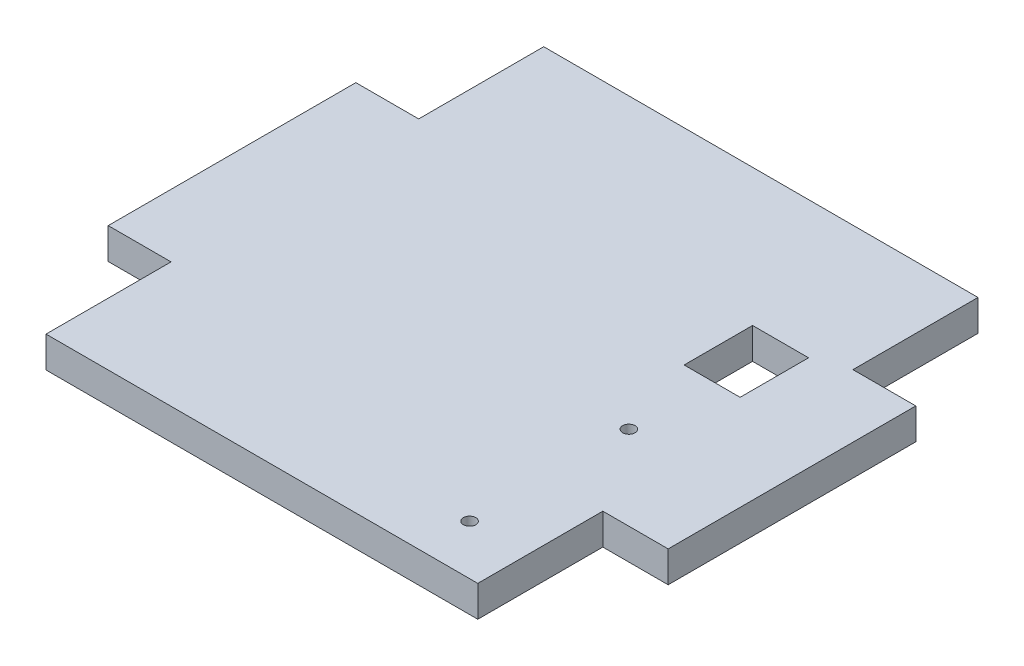
ISO-10303-21;
HEADER;
FILE_DESCRIPTION(('STEP AP214'),'2;1');
FILE_NAME('part.step','',(''),(''),'','','');
FILE_SCHEMA(('AUTOMOTIVE_DESIGN { 1 0 10303 214 1 1 1 1 }'));
ENDSEC;
DATA;
#1=APPLICATION_CONTEXT('core data for automotive mechanical design processes');
#2=APPLICATION_PROTOCOL_DEFINITION('international standard','automotive_design',2000,#1);
#3=PRODUCT_CONTEXT('',#1,'mechanical');
#4=PRODUCT('Part','Part','',(#3));
#5=PRODUCT_RELATED_PRODUCT_CATEGORY('part','',(#4));
#6=PRODUCT_DEFINITION_FORMATION('','',#4);
#7=PRODUCT_DEFINITION_CONTEXT('part definition',#1,'design');
#8=PRODUCT_DEFINITION('design','',#6,#7);
#9=PRODUCT_DEFINITION_SHAPE('','',#8);
#10=(LENGTH_UNIT() NAMED_UNIT(*) SI_UNIT(.MILLI.,.METRE.));
#11=(NAMED_UNIT(*) PLANE_ANGLE_UNIT() SI_UNIT($,.RADIAN.));
#12=(NAMED_UNIT(*) SI_UNIT($,.STERADIAN.) SOLID_ANGLE_UNIT());
#13=UNCERTAINTY_MEASURE_WITH_UNIT(LENGTH_MEASURE(1.E-05),#10,'distance_accuracy_value','');
#14=(GEOMETRIC_REPRESENTATION_CONTEXT(3) GLOBAL_UNCERTAINTY_ASSIGNED_CONTEXT((#13)) GLOBAL_UNIT_ASSIGNED_CONTEXT((#10,
#11,#12)) REPRESENTATION_CONTEXT('',''));
#15=CARTESIAN_POINT('',(0.,0.,0.));
#16=DIRECTION('',(0.,0.,1.));
#17=DIRECTION('',(1.,0.,0.));
#18=AXIS2_PLACEMENT_3D('',#15,#16,#17);
#19=CARTESIAN_POINT('',(-424.861111111111,50.,-93.9750109953703));
#20=DIRECTION('',(1.,0.,0.));
#21=DIRECTION('',(0.,0.,-1.));
#22=AXIS2_PLACEMENT_3D('',#19,#20,#21);
#23=PLANE('',#22);
#24=DIRECTION('',(0.,0.,1.));
#25=VECTOR('',#24,1.);
#26=CARTESIAN_POINT('',(-424.861111111111,0.,-93.9750109953703));
#27=LINE('',#26,#25);
#28=CARTESIAN_POINT('',(-424.861111111111,0.,-294.97501099537));
#29=VERTEX_POINT('',#28);
#30=CARTESIAN_POINT('',(-424.861111111111,0.,-93.9750109953703));
#31=VERTEX_POINT('',#30);
#32=EDGE_CURVE('E197',#29,#31,#27,.T.);
#33=ORIENTED_EDGE('',*,*,#32,.T.);
#34=DIRECTION('',(0.,-1.,0.));
#35=VECTOR('',#34,1.);
#36=CARTESIAN_POINT('',(-424.861111111111,50.,-93.9750109953703));
#37=LINE('',#36,#35);
#38=CARTESIAN_POINT('',(-424.861111111111,50.,-93.9750109953703));
#39=VERTEX_POINT('',#38);
#40=EDGE_CURVE('E11',#39,#31,#37,.T.);
#41=ORIENTED_EDGE('',*,*,#40,.F.);
#42=DIRECTION('',(0.,0.,1.));
#43=VECTOR('',#42,1.);
#44=CARTESIAN_POINT('',(-424.861111111111,50.,-93.9750109953703));
#45=LINE('',#44,#43);
#46=CARTESIAN_POINT('',(-424.861111111111,50.,-294.97501099537));
#47=VERTEX_POINT('',#46);
#48=EDGE_CURVE('E198',#47,#39,#45,.T.);
#49=ORIENTED_EDGE('',*,*,#48,.F.);
#50=DIRECTION('',(0.,-1.,0.));
#51=VECTOR('',#50,1.);
#52=CARTESIAN_POINT('',(-424.861111111111,50.,-294.97501099537));
#53=LINE('',#52,#51);
#54=EDGE_CURVE('E224',#47,#29,#53,.T.);
#55=ORIENTED_EDGE('',*,*,#54,.T.);
#56=EDGE_LOOP('',(#33,#41,#49,#55));
#57=FACE_BOUND('',#56,.T.);
#58=ADVANCED_FACE('F37',(#57),#23,.F.);
#59=CARTESIAN_POINT('',(-525.861111111111,50.,-93.9750109953703));
#60=DIRECTION('',(0.,0.,1.));
#61=DIRECTION('',(1.,0.,0.));
#62=AXIS2_PLACEMENT_3D('',#59,#60,#61);
#63=PLANE('',#62);
#64=DIRECTION('',(-1.,0.,0.));
#65=VECTOR('',#64,1.);
#66=CARTESIAN_POINT('',(-525.861111111111,0.,-93.9750109953703));
#67=LINE('',#66,#65);
#68=CARTESIAN_POINT('',(-525.861111111111,0.,-93.9750109953703));
#69=VERTEX_POINT('',#68);
#70=EDGE_CURVE('E227',#31,#69,#67,.T.);
#71=ORIENTED_EDGE('',*,*,#70,.T.);
#72=DIRECTION('',(0.,-1.,0.));
#73=VECTOR('',#72,1.);
#74=CARTESIAN_POINT('',(-525.861111111111,50.,-93.9750109953703));
#75=LINE('',#74,#73);
#76=CARTESIAN_POINT('',(-525.861111111111,50.,-93.9750109953703));
#77=VERTEX_POINT('',#76);
#78=EDGE_CURVE('E44',#77,#69,#75,.T.);
#79=ORIENTED_EDGE('',*,*,#78,.F.);
#80=DIRECTION('',(-1.,0.,0.));
#81=VECTOR('',#80,1.);
#82=CARTESIAN_POINT('',(-525.861111111111,50.,-93.9750109953703));
#83=LINE('',#82,#81);
#84=EDGE_CURVE('E201',#39,#77,#83,.T.);
#85=ORIENTED_EDGE('',*,*,#84,.F.);
#86=ORIENTED_EDGE('',*,*,#40,.T.);
#87=EDGE_LOOP('',(#71,#79,#85,#86));
#88=FACE_BOUND('',#87,.T.);
#89=ADVANCED_FACE('F303',(#88),#63,.F.);
#90=CARTESIAN_POINT('',(-525.861111111111,50.,-93.9750109953703));
#91=DIRECTION('',(1.,0.,0.));
#92=DIRECTION('',(0.,0.,-1.));
#93=AXIS2_PLACEMENT_3D('',#90,#91,#92);
#94=PLANE('',#93);
#95=DIRECTION('',(0.,0.,1.));
#96=VECTOR('',#95,1.);
#97=CARTESIAN_POINT('',(-525.861111111111,0.,-93.9750109953703));
#98=LINE('',#97,#96);
#99=CARTESIAN_POINT('',(-525.861111111111,0.,304.02498900463));
#100=VERTEX_POINT('',#99);
#101=EDGE_CURVE('E229',#69,#100,#98,.T.);
#102=ORIENTED_EDGE('',*,*,#101,.T.);
#103=DIRECTION('',(0.,-1.,0.));
#104=VECTOR('',#103,1.);
#105=CARTESIAN_POINT('',(-525.861111111111,50.,304.02498900463));
#106=LINE('',#105,#104);
#107=CARTESIAN_POINT('',(-525.861111111111,50.,304.02498900463));
#108=VERTEX_POINT('',#107);
#109=EDGE_CURVE('E274',#108,#100,#106,.T.);
#110=ORIENTED_EDGE('',*,*,#109,.F.);
#111=DIRECTION('',(0.,0.,1.));
#112=VECTOR('',#111,1.);
#113=CARTESIAN_POINT('',(-525.861111111111,50.,-93.9750109953703));
#114=LINE('',#113,#112);
#115=EDGE_CURVE('E204',#77,#108,#114,.T.);
#116=ORIENTED_EDGE('',*,*,#115,.F.);
#117=ORIENTED_EDGE('',*,*,#78,.T.);
#118=EDGE_LOOP('',(#102,#110,#116,#117));
#119=FACE_BOUND('',#118,.T.);
#120=ADVANCED_FACE('F281',(#119),#94,.F.);
#121=CARTESIAN_POINT('',(-525.861111111111,50.,304.02498900463));
#122=DIRECTION('',(0.,0.,-1.));
#123=DIRECTION('',(-1.,0.,0.));
#124=AXIS2_PLACEMENT_3D('',#121,#122,#123);
#125=PLANE('',#124);
#126=DIRECTION('',(1.,0.,0.));
#127=VECTOR('',#126,1.);
#128=CARTESIAN_POINT('',(-525.861111111111,0.,304.02498900463));
#129=LINE('',#128,#127);
#130=CARTESIAN_POINT('',(-424.861111111111,0.,304.02498900463));
#131=VERTEX_POINT('',#130);
#132=EDGE_CURVE('E231',#100,#131,#129,.T.);
#133=ORIENTED_EDGE('',*,*,#132,.T.);
#134=DIRECTION('',(0.,-1.,0.));
#135=VECTOR('',#134,1.);
#136=CARTESIAN_POINT('',(-424.861111111111,50.,304.02498900463));
#137=LINE('',#136,#135);
#138=CARTESIAN_POINT('',(-424.861111111111,50.,304.02498900463));
#139=VERTEX_POINT('',#138);
#140=EDGE_CURVE('E271',#139,#131,#137,.T.);
#141=ORIENTED_EDGE('',*,*,#140,.F.);
#142=DIRECTION('',(1.,0.,0.));
#143=VECTOR('',#142,1.);
#144=CARTESIAN_POINT('',(-525.861111111111,50.,304.02498900463));
#145=LINE('',#144,#143);
#146=EDGE_CURVE('E206',#108,#139,#145,.T.);
#147=ORIENTED_EDGE('',*,*,#146,.F.);
#148=ORIENTED_EDGE('',*,*,#109,.T.);
#149=EDGE_LOOP('',(#133,#141,#147,#148));
#150=FACE_BOUND('',#149,.T.);
#151=ADVANCED_FACE('F291',(#150),#125,.F.);
#152=CARTESIAN_POINT('',(-424.861111111111,50.,304.02498900463));
#153=DIRECTION('',(1.,0.,0.));
#154=DIRECTION('',(0.,0.,-1.));
#155=AXIS2_PLACEMENT_3D('',#152,#153,#154);
#156=PLANE('',#155);
#157=DIRECTION('',(0.,0.,1.));
#158=VECTOR('',#157,1.);
#159=CARTESIAN_POINT('',(-424.861111111111,0.,304.02498900463));
#160=LINE('',#159,#158);
#161=CARTESIAN_POINT('',(-424.861111111111,0.,505.02498900463));
#162=VERTEX_POINT('',#161);
#163=EDGE_CURVE('E233',#131,#162,#160,.T.);
#164=ORIENTED_EDGE('',*,*,#163,.T.);
#165=DIRECTION('',(0.,-1.,0.));
#166=VECTOR('',#165,1.);
#167=CARTESIAN_POINT('',(-424.861111111111,50.,505.02498900463));
#168=LINE('',#167,#166);
#169=CARTESIAN_POINT('',(-424.861111111111,50.,505.02498900463));
#170=VERTEX_POINT('',#169);
#171=EDGE_CURVE('E268',#170,#162,#168,.T.);
#172=ORIENTED_EDGE('',*,*,#171,.F.);
#173=DIRECTION('',(0.,0.,1.));
#174=VECTOR('',#173,1.);
#175=CARTESIAN_POINT('',(-424.861111111111,50.,304.02498900463));
#176=LINE('',#175,#174);
#177=EDGE_CURVE('E208',#139,#170,#176,.T.);
#178=ORIENTED_EDGE('',*,*,#177,.F.);
#179=ORIENTED_EDGE('',*,*,#140,.T.);
#180=EDGE_LOOP('',(#164,#172,#178,#179));
#181=FACE_BOUND('',#180,.T.);
#182=ADVANCED_FACE('F295',(#181),#156,.F.);
#183=CARTESIAN_POINT('',(-424.861111111111,50.,505.02498900463));
#184=DIRECTION('',(0.,0.,-1.));
#185=DIRECTION('',(-1.,0.,0.));
#186=AXIS2_PLACEMENT_3D('',#183,#184,#185);
#187=PLANE('',#186);
#188=DIRECTION('',(1.,0.,0.));
#189=VECTOR('',#188,1.);
#190=CARTESIAN_POINT('',(-424.861111111111,0.,505.02498900463));
#191=LINE('',#190,#189);
#192=CARTESIAN_POINT('',(269.138888888889,0.,505.02498900463));
#193=VERTEX_POINT('',#192);
#194=EDGE_CURVE('E235',#162,#193,#191,.T.);
#195=ORIENTED_EDGE('',*,*,#194,.T.);
#196=DIRECTION('',(0.,-1.,0.));
#197=VECTOR('',#196,1.);
#198=CARTESIAN_POINT('',(269.138888888889,50.,505.02498900463));
#199=LINE('',#198,#197);
#200=CARTESIAN_POINT('',(269.138888888889,50.,505.02498900463));
#201=VERTEX_POINT('',#200);
#202=EDGE_CURVE('E265',#201,#193,#199,.T.);
#203=ORIENTED_EDGE('',*,*,#202,.F.);
#204=DIRECTION('',(1.,0.,0.));
#205=VECTOR('',#204,1.);
#206=CARTESIAN_POINT('',(-424.861111111111,50.,505.02498900463));
#207=LINE('',#206,#205);
#208=EDGE_CURVE('E210',#170,#201,#207,.T.);
#209=ORIENTED_EDGE('',*,*,#208,.F.);
#210=ORIENTED_EDGE('',*,*,#171,.T.);
#211=EDGE_LOOP('',(#195,#203,#209,#210));
#212=FACE_BOUND('',#211,.T.);
#213=ADVANCED_FACE('F336',(#212),#187,.F.);
#214=CARTESIAN_POINT('',(269.138888888889,50.,304.02498900463));
#215=DIRECTION('',(-1.,0.,0.));
#216=DIRECTION('',(0.,0.,1.));
#217=AXIS2_PLACEMENT_3D('',#214,#215,#216);
#218=PLANE('',#217);
#219=DIRECTION('',(0.,0.,-1.));
#220=VECTOR('',#219,1.);
#221=CARTESIAN_POINT('',(269.138888888889,0.,304.02498900463));
#222=LINE('',#221,#220);
#223=CARTESIAN_POINT('',(269.138888888889,0.,304.02498900463));
#224=VERTEX_POINT('',#223);
#225=EDGE_CURVE('E237',#193,#224,#222,.T.);
#226=ORIENTED_EDGE('',*,*,#225,.T.);
#227=DIRECTION('',(0.,-1.,0.));
#228=VECTOR('',#227,1.);
#229=CARTESIAN_POINT('',(269.138888888889,50.,304.02498900463));
#230=LINE('',#229,#228);
#231=CARTESIAN_POINT('',(269.138888888889,50.,304.02498900463));
#232=VERTEX_POINT('',#231);
#233=EDGE_CURVE('E262',#232,#224,#230,.T.);
#234=ORIENTED_EDGE('',*,*,#233,.F.);
#235=DIRECTION('',(0.,0.,-1.));
#236=VECTOR('',#235,1.);
#237=CARTESIAN_POINT('',(269.138888888889,50.,304.02498900463));
#238=LINE('',#237,#236);
#239=EDGE_CURVE('E212',#201,#232,#238,.T.);
#240=ORIENTED_EDGE('',*,*,#239,.F.);
#241=ORIENTED_EDGE('',*,*,#202,.T.);
#242=EDGE_LOOP('',(#226,#234,#240,#241));
#243=FACE_BOUND('',#242,.T.);
#244=ADVANCED_FACE('F334',(#243),#218,.F.);
#245=CARTESIAN_POINT('',(374.138888888889,50.,304.02498900463));
#246=DIRECTION('',(0.,0.,-1.));
#247=DIRECTION('',(-1.,0.,0.));
#248=AXIS2_PLACEMENT_3D('',#245,#246,#247);
#249=PLANE('',#248);
#250=DIRECTION('',(1.,0.,0.));
#251=VECTOR('',#250,1.);
#252=CARTESIAN_POINT('',(374.138888888889,0.,304.02498900463));
#253=LINE('',#252,#251);
#254=CARTESIAN_POINT('',(374.138888888889,0.,304.02498900463));
#255=VERTEX_POINT('',#254);
#256=EDGE_CURVE('E239',#224,#255,#253,.T.);
#257=ORIENTED_EDGE('',*,*,#256,.T.);
#258=DIRECTION('',(0.,-1.,0.));
#259=VECTOR('',#258,1.);
#260=CARTESIAN_POINT('',(374.138888888889,50.,304.02498900463));
#261=LINE('',#260,#259);
#262=CARTESIAN_POINT('',(374.138888888889,50.,304.02498900463));
#263=VERTEX_POINT('',#262);
#264=EDGE_CURVE('E259',#263,#255,#261,.T.);
#265=ORIENTED_EDGE('',*,*,#264,.F.);
#266=DIRECTION('',(1.,0.,0.));
#267=VECTOR('',#266,1.);
#268=CARTESIAN_POINT('',(374.138888888889,50.,304.02498900463));
#269=LINE('',#268,#267);
#270=EDGE_CURVE('E214',#232,#263,#269,.T.);
#271=ORIENTED_EDGE('',*,*,#270,.F.);
#272=ORIENTED_EDGE('',*,*,#233,.T.);
#273=EDGE_LOOP('',(#257,#265,#271,#272));
#274=FACE_BOUND('',#273,.T.);
#275=ADVANCED_FACE('F330',(#274),#249,.F.);
#276=CARTESIAN_POINT('',(374.138888888889,50.,-93.9750109953704));
#277=DIRECTION('',(-1.,0.,0.));
#278=DIRECTION('',(0.,0.,1.));
#279=AXIS2_PLACEMENT_3D('',#276,#277,#278);
#280=PLANE('',#279);
#281=DIRECTION('',(0.,0.,-1.));
#282=VECTOR('',#281,1.);
#283=CARTESIAN_POINT('',(374.138888888889,0.,-93.9750109953704));
#284=LINE('',#283,#282);
#285=CARTESIAN_POINT('',(374.138888888889,0.,-93.9750109953704));
#286=VERTEX_POINT('',#285);
#287=EDGE_CURVE('E241',#255,#286,#284,.T.);
#288=ORIENTED_EDGE('',*,*,#287,.T.);
#289=DIRECTION('',(0.,-1.,0.));
#290=VECTOR('',#289,1.);
#291=CARTESIAN_POINT('',(374.138888888889,50.,-93.9750109953704));
#292=LINE('',#291,#290);
#293=CARTESIAN_POINT('',(374.138888888889,50.,-93.9750109953704));
#294=VERTEX_POINT('',#293);
#295=EDGE_CURVE('E256',#294,#286,#292,.T.);
#296=ORIENTED_EDGE('',*,*,#295,.F.);
#297=DIRECTION('',(0.,0.,-1.));
#298=VECTOR('',#297,1.);
#299=CARTESIAN_POINT('',(374.138888888889,50.,-93.9750109953704));
#300=LINE('',#299,#298);
#301=EDGE_CURVE('E216',#263,#294,#300,.T.);
#302=ORIENTED_EDGE('',*,*,#301,.F.);
#303=ORIENTED_EDGE('',*,*,#264,.T.);
#304=EDGE_LOOP('',(#288,#296,#302,#303));
#305=FACE_BOUND('',#304,.T.);
#306=ADVANCED_FACE('F325',(#305),#280,.F.);
#307=CARTESIAN_POINT('',(374.138888888889,50.,-93.9750109953704));
#308=DIRECTION('',(0.,0.,1.));
#309=DIRECTION('',(1.,0.,0.));
#310=AXIS2_PLACEMENT_3D('',#307,#308,#309);
#311=PLANE('',#310);
#312=DIRECTION('',(-1.,0.,0.));
#313=VECTOR('',#312,1.);
#314=CARTESIAN_POINT('',(374.138888888889,0.,-93.9750109953704));
#315=LINE('',#314,#313);
#316=CARTESIAN_POINT('',(273.138888888889,0.,-93.9750109953704));
#317=VERTEX_POINT('',#316);
#318=EDGE_CURVE('E243',#286,#317,#315,.T.);
#319=ORIENTED_EDGE('',*,*,#318,.T.);
#320=DIRECTION('',(0.,-1.,0.));
#321=VECTOR('',#320,1.);
#322=CARTESIAN_POINT('',(273.138888888889,50.,-93.9750109953704));
#323=LINE('',#322,#321);
#324=CARTESIAN_POINT('',(273.138888888889,50.,-93.9750109953704));
#325=VERTEX_POINT('',#324);
#326=EDGE_CURVE('E253',#325,#317,#323,.T.);
#327=ORIENTED_EDGE('',*,*,#326,.F.);
#328=DIRECTION('',(-1.,0.,0.));
#329=VECTOR('',#328,1.);
#330=CARTESIAN_POINT('',(374.138888888889,50.,-93.9750109953704));
#331=LINE('',#330,#329);
#332=EDGE_CURVE('E218',#294,#325,#331,.T.);
#333=ORIENTED_EDGE('',*,*,#332,.F.);
#334=ORIENTED_EDGE('',*,*,#295,.T.);
#335=EDGE_LOOP('',(#319,#327,#333,#334));
#336=FACE_BOUND('',#335,.T.);
#337=ADVANCED_FACE('F319',(#336),#311,.F.);
#338=CARTESIAN_POINT('',(273.138888888889,50.,-93.9750109953704));
#339=DIRECTION('',(-1.,0.,0.));
#340=DIRECTION('',(0.,0.,1.));
#341=AXIS2_PLACEMENT_3D('',#338,#339,#340);
#342=PLANE('',#341);
#343=DIRECTION('',(0.,0.,-1.));
#344=VECTOR('',#343,1.);
#345=CARTESIAN_POINT('',(273.138888888889,0.,-93.9750109953704));
#346=LINE('',#345,#344);
#347=CARTESIAN_POINT('',(273.138888888889,0.,-294.97501099537));
#348=VERTEX_POINT('',#347);
#349=EDGE_CURVE('E245',#317,#348,#346,.T.);
#350=ORIENTED_EDGE('',*,*,#349,.T.);
#351=DIRECTION('',(0.,-1.,0.));
#352=VECTOR('',#351,1.);
#353=CARTESIAN_POINT('',(273.138888888889,50.,-294.97501099537));
#354=LINE('',#353,#352);
#355=CARTESIAN_POINT('',(273.138888888889,50.,-294.97501099537));
#356=VERTEX_POINT('',#355);
#357=EDGE_CURVE('E250',#356,#348,#354,.T.);
#358=ORIENTED_EDGE('',*,*,#357,.F.);
#359=DIRECTION('',(0.,0.,-1.));
#360=VECTOR('',#359,1.);
#361=CARTESIAN_POINT('',(273.138888888889,50.,-93.9750109953704));
#362=LINE('',#361,#360);
#363=EDGE_CURVE('E220',#325,#356,#362,.T.);
#364=ORIENTED_EDGE('',*,*,#363,.F.);
#365=ORIENTED_EDGE('',*,*,#326,.T.);
#366=EDGE_LOOP('',(#350,#358,#364,#365));
#367=FACE_BOUND('',#366,.T.);
#368=ADVANCED_FACE('F315',(#367),#342,.F.);
#369=CARTESIAN_POINT('',(-424.861111111111,50.,-294.97501099537));
#370=DIRECTION('',(0.,0.,1.));
#371=DIRECTION('',(1.,0.,0.));
#372=AXIS2_PLACEMENT_3D('',#369,#370,#371);
#373=PLANE('',#372);
#374=DIRECTION('',(-1.,0.,0.));
#375=VECTOR('',#374,1.);
#376=CARTESIAN_POINT('',(-424.861111111111,0.,-294.97501099537));
#377=LINE('',#376,#375);
#378=EDGE_CURVE('E202',#348,#29,#377,.T.);
#379=ORIENTED_EDGE('',*,*,#378,.T.);
#380=ORIENTED_EDGE('',*,*,#54,.F.);
#381=DIRECTION('',(-1.,0.,0.));
#382=VECTOR('',#381,1.);
#383=CARTESIAN_POINT('',(-424.861111111111,50.,-294.97501099537));
#384=LINE('',#383,#382);
#385=EDGE_CURVE('E222',#356,#47,#384,.T.);
#386=ORIENTED_EDGE('',*,*,#385,.F.);
#387=ORIENTED_EDGE('',*,*,#357,.T.);
#388=EDGE_LOOP('',(#379,#380,#386,#387));
#389=FACE_BOUND('',#388,.T.);
#390=ADVANCED_FACE('F310',(#389),#373,.F.);
#391=CARTESIAN_POINT('',(0.,50.,0.));
#392=DIRECTION('',(0.,-1.,0.));
#393=DIRECTION('',(0.,0.,-1.));
#394=AXIS2_PLACEMENT_3D('',#391,#392,#393);
#395=PLANE('',#394);
#396=DIRECTION('',(1.,0.,0.));
#397=VECTOR('',#396,1.);
#398=CARTESIAN_POINT('',(0.,50.,35.1922933527027));
#399=LINE('',#398,#397);
#400=CARTESIAN_POINT('',(130.98229435472,50.,35.1922933527027));
#401=VERTEX_POINT('',#400);
#402=CARTESIAN_POINT('',(220.98229435472,50.,35.1922933527027));
#403=VERTEX_POINT('',#402);
#404=EDGE_CURVE('E152',#401,#403,#399,.T.);
#405=ORIENTED_EDGE('',*,*,#404,.F.);
#406=DIRECTION('',(0.,0.,1.));
#407=VECTOR('',#406,1.);
#408=CARTESIAN_POINT('',(130.98229435472,50.,0.));
#409=LINE('',#408,#407);
#410=CARTESIAN_POINT('',(130.98229435472,50.,-74.8077066472973));
#411=VERTEX_POINT('',#410);
#412=EDGE_CURVE('E190',#411,#401,#409,.T.);
#413=ORIENTED_EDGE('',*,*,#412,.F.);
#414=DIRECTION('',(-1.,0.,0.));
#415=VECTOR('',#414,1.);
#416=CARTESIAN_POINT('',(0.,50.,-74.8077066472973));
#417=LINE('',#416,#415);
#418=CARTESIAN_POINT('',(220.98229435472,50.,-74.8077066472973));
#419=VERTEX_POINT('',#418);
#420=EDGE_CURVE('E192',#419,#411,#417,.T.);
#421=ORIENTED_EDGE('',*,*,#420,.F.);
#422=DIRECTION('',(0.,0.,-1.));
#423=VECTOR('',#422,1.);
#424=CARTESIAN_POINT('',(220.98229435472,50.,0.));
#425=LINE('',#424,#423);
#426=EDGE_CURVE('E194',#403,#419,#425,.T.);
#427=ORIENTED_EDGE('',*,*,#426,.F.);
#428=EDGE_LOOP('',(#405,#413,#421,#427));
#429=FACE_BOUND('',#428,.T.);
#430=CARTESIAN_POINT('',(175.98229435472,50.,425.02498900463));
#431=DIRECTION('',(0.,-1.,0.));
#432=DIRECTION('',(0.,0.,-1.));
#433=AXIS2_PLACEMENT_3D('',#430,#431,#432);
#434=CIRCLE('',#433,10.);
#435=CARTESIAN_POINT('',(175.98229435472,50.,415.02498900463));
#436=VERTEX_POINT('',#435);
#437=EDGE_CURVE('E187',#436,#436,#434,.F.);
#438=ORIENTED_EDGE('',*,*,#437,.F.);
#439=EDGE_LOOP('',(#438));
#440=FACE_BOUND('',#439,.T.);
#441=CARTESIAN_POINT('',(175.98229435472,50.,169.02498900463));
#442=DIRECTION('',(0.,-1.,0.));
#443=DIRECTION('',(0.,0.,-1.));
#444=AXIS2_PLACEMENT_3D('',#441,#442,#443);
#445=CIRCLE('',#444,10.);
#446=CARTESIAN_POINT('',(175.98229435472,50.,159.02498900463));
#447=VERTEX_POINT('',#446);
#448=EDGE_CURVE('E155',#447,#447,#445,.F.);
#449=ORIENTED_EDGE('',*,*,#448,.F.);
#450=EDGE_LOOP('',(#449));
#451=FACE_BOUND('',#450,.T.);
#452=ORIENTED_EDGE('',*,*,#48,.T.);
#453=ORIENTED_EDGE('',*,*,#84,.T.);
#454=ORIENTED_EDGE('',*,*,#115,.T.);
#455=ORIENTED_EDGE('',*,*,#146,.T.);
#456=ORIENTED_EDGE('',*,*,#177,.T.);
#457=ORIENTED_EDGE('',*,*,#208,.T.);
#458=ORIENTED_EDGE('',*,*,#239,.T.);
#459=ORIENTED_EDGE('',*,*,#270,.T.);
#460=ORIENTED_EDGE('',*,*,#301,.T.);
#461=ORIENTED_EDGE('',*,*,#332,.T.);
#462=ORIENTED_EDGE('',*,*,#363,.T.);
#463=ORIENTED_EDGE('',*,*,#385,.T.);
#464=EDGE_LOOP('',(#452,#453,#454,#455,#456,#457,#458,#459,#460,#461,#462,#463));
#465=FACE_BOUND('',#464,.T.);
#466=ADVANCED_FACE('F299',(#429,#440,#451,#465),#395,.F.);
#467=CARTESIAN_POINT('',(0.,0.,0.));
#468=DIRECTION('',(0.,-1.,0.));
#469=DIRECTION('',(0.,0.,-1.));
#470=AXIS2_PLACEMENT_3D('',#467,#468,#469);
#471=PLANE('',#470);
#472=DIRECTION('',(0.,0.,1.));
#473=VECTOR('',#472,1.);
#474=CARTESIAN_POINT('',(130.98229435472,0.,0.));
#475=LINE('',#474,#473);
#476=CARTESIAN_POINT('',(130.98229435472,0.,-74.8077066472973));
#477=VERTEX_POINT('',#476);
#478=CARTESIAN_POINT('',(130.98229435472,0.,35.1922933527027));
#479=VERTEX_POINT('',#478);
#480=EDGE_CURVE('E170',#477,#479,#475,.T.);
#481=ORIENTED_EDGE('',*,*,#480,.T.);
#482=DIRECTION('',(1.,0.,0.));
#483=VECTOR('',#482,1.);
#484=CARTESIAN_POINT('',(0.,0.,35.1922933527027));
#485=LINE('',#484,#483);
#486=CARTESIAN_POINT('',(220.98229435472,0.,35.1922933527027));
#487=VERTEX_POINT('',#486);
#488=EDGE_CURVE('E59',#479,#487,#485,.T.);
#489=ORIENTED_EDGE('',*,*,#488,.T.);
#490=DIRECTION('',(0.,0.,-1.));
#491=VECTOR('',#490,1.);
#492=CARTESIAN_POINT('',(220.98229435472,0.,0.));
#493=LINE('',#492,#491);
#494=CARTESIAN_POINT('',(220.98229435472,0.,-74.8077066472973));
#495=VERTEX_POINT('',#494);
#496=EDGE_CURVE('E159',#487,#495,#493,.T.);
#497=ORIENTED_EDGE('',*,*,#496,.T.);
#498=DIRECTION('',(-1.,0.,0.));
#499=VECTOR('',#498,1.);
#500=CARTESIAN_POINT('',(0.,0.,-74.8077066472973));
#501=LINE('',#500,#499);
#502=EDGE_CURVE('E165',#495,#477,#501,.T.);
#503=ORIENTED_EDGE('',*,*,#502,.T.);
#504=EDGE_LOOP('',(#481,#489,#497,#503));
#505=FACE_BOUND('',#504,.T.);
#506=CARTESIAN_POINT('',(175.98229435472,0.,425.02498900463));
#507=DIRECTION('',(0.,1.,0.));
#508=DIRECTION('',(0.,0.,1.));
#509=AXIS2_PLACEMENT_3D('',#506,#507,#508);
#510=CIRCLE('',#509,10.);
#511=CARTESIAN_POINT('',(175.98229435472,0.,435.02498900463));
#512=VERTEX_POINT('',#511);
#513=EDGE_CURVE('E171',#512,#512,#510,.T.);
#514=ORIENTED_EDGE('',*,*,#513,.T.);
#515=EDGE_LOOP('',(#514));
#516=FACE_BOUND('',#515,.T.);
#517=CARTESIAN_POINT('',(175.98229435472,0.,169.02498900463));
#518=DIRECTION('',(0.,1.,0.));
#519=DIRECTION('',(0.,0.,1.));
#520=AXIS2_PLACEMENT_3D('',#517,#518,#519);
#521=CIRCLE('',#520,10.);
#522=CARTESIAN_POINT('',(175.98229435472,0.,179.02498900463));
#523=VERTEX_POINT('',#522);
#524=EDGE_CURVE('E174',#523,#523,#521,.T.);
#525=ORIENTED_EDGE('',*,*,#524,.T.);
#526=EDGE_LOOP('',(#525));
#527=FACE_BOUND('',#526,.T.);
#528=ORIENTED_EDGE('',*,*,#32,.F.);
#529=ORIENTED_EDGE('',*,*,#378,.F.);
#530=ORIENTED_EDGE('',*,*,#349,.F.);
#531=ORIENTED_EDGE('',*,*,#318,.F.);
#532=ORIENTED_EDGE('',*,*,#287,.F.);
#533=ORIENTED_EDGE('',*,*,#256,.F.);
#534=ORIENTED_EDGE('',*,*,#225,.F.);
#535=ORIENTED_EDGE('',*,*,#194,.F.);
#536=ORIENTED_EDGE('',*,*,#163,.F.);
#537=ORIENTED_EDGE('',*,*,#132,.F.);
#538=ORIENTED_EDGE('',*,*,#101,.F.);
#539=ORIENTED_EDGE('',*,*,#70,.F.);
#540=EDGE_LOOP('',(#528,#529,#530,#531,#532,#533,#534,#535,#536,#537,#538,#539));
#541=FACE_BOUND('',#540,.T.);
#542=ADVANCED_FACE('F168',(#505,#516,#527,#541),#471,.T.);
#543=CARTESIAN_POINT('',(175.98229435472,53.,169.02498900463));
#544=DIRECTION('',(0.,-1.,0.));
#545=DIRECTION('',(0.,0.,-1.));
#546=AXIS2_PLACEMENT_3D('',#543,#544,#545);
#547=CYLINDRICAL_SURFACE('',#546,10.);
#548=ORIENTED_EDGE('',*,*,#524,.F.);
#549=EDGE_LOOP('',(#548));
#550=FACE_BOUND('',#549,.T.);
#551=ORIENTED_EDGE('',*,*,#448,.T.);
#552=EDGE_LOOP('',(#551));
#553=FACE_BOUND('',#552,.T.);
#554=ADVANCED_FACE('F440',(#550,#553),#547,.F.);
#555=CARTESIAN_POINT('',(175.98229435472,53.,425.02498900463));
#556=DIRECTION('',(0.,-1.,0.));
#557=DIRECTION('',(0.,0.,-1.));
#558=AXIS2_PLACEMENT_3D('',#555,#556,#557);
#559=CYLINDRICAL_SURFACE('',#558,10.);
#560=ORIENTED_EDGE('',*,*,#513,.F.);
#561=EDGE_LOOP('',(#560));
#562=FACE_BOUND('',#561,.T.);
#563=ORIENTED_EDGE('',*,*,#437,.T.);
#564=EDGE_LOOP('',(#563));
#565=FACE_BOUND('',#564,.T.);
#566=ADVANCED_FACE('F450',(#562,#565),#559,.F.);
#567=CARTESIAN_POINT('',(0.,53.,35.1922933527027));
#568=DIRECTION('',(0.,0.,-1.));
#569=DIRECTION('',(-1.,0.,0.));
#570=AXIS2_PLACEMENT_3D('',#567,#568,#569);
#571=PLANE('',#570);
#572=ORIENTED_EDGE('',*,*,#404,.T.);
#573=DIRECTION('',(0.,-1.,0.));
#574=VECTOR('',#573,1.);
#575=CARTESIAN_POINT('',(220.98229435472,53.,35.1922933527027));
#576=LINE('',#575,#574);
#577=EDGE_CURVE('E148',#403,#487,#576,.T.);
#578=ORIENTED_EDGE('',*,*,#577,.T.);
#579=ORIENTED_EDGE('',*,*,#488,.F.);
#580=DIRECTION('',(0.,-1.,0.));
#581=VECTOR('',#580,1.);
#582=CARTESIAN_POINT('',(130.98229435472,53.,35.1922933527027));
#583=LINE('',#582,#581);
#584=EDGE_CURVE('E179',#401,#479,#583,.T.);
#585=ORIENTED_EDGE('',*,*,#584,.F.);
#586=EDGE_LOOP('',(#572,#578,#579,#585));
#587=FACE_BOUND('',#586,.T.);
#588=ADVANCED_FACE('F150',(#587),#571,.T.);
#589=CARTESIAN_POINT('',(220.98229435472,53.,0.));
#590=DIRECTION('',(-1.,0.,0.));
#591=DIRECTION('',(0.,0.,1.));
#592=AXIS2_PLACEMENT_3D('',#589,#590,#591);
#593=PLANE('',#592);
#594=ORIENTED_EDGE('',*,*,#426,.T.);
#595=DIRECTION('',(0.,-1.,0.));
#596=VECTOR('',#595,1.);
#597=CARTESIAN_POINT('',(220.98229435472,53.,-74.8077066472973));
#598=LINE('',#597,#596);
#599=EDGE_CURVE('E156',#419,#495,#598,.T.);
#600=ORIENTED_EDGE('',*,*,#599,.T.);
#601=ORIENTED_EDGE('',*,*,#496,.F.);
#602=ORIENTED_EDGE('',*,*,#577,.F.);
#603=EDGE_LOOP('',(#594,#600,#601,#602));
#604=FACE_BOUND('',#603,.T.);
#605=ADVANCED_FACE('F160',(#604),#593,.T.);
#606=CARTESIAN_POINT('',(0.,53.,-74.8077066472973));
#607=DIRECTION('',(0.,0.,1.));
#608=DIRECTION('',(1.,0.,0.));
#609=AXIS2_PLACEMENT_3D('',#606,#607,#608);
#610=PLANE('',#609);
#611=ORIENTED_EDGE('',*,*,#420,.T.);
#612=DIRECTION('',(0.,-1.,0.));
#613=VECTOR('',#612,1.);
#614=CARTESIAN_POINT('',(130.98229435472,53.,-74.8077066472973));
#615=LINE('',#614,#613);
#616=EDGE_CURVE('E51',#411,#477,#615,.T.);
#617=ORIENTED_EDGE('',*,*,#616,.T.);
#618=ORIENTED_EDGE('',*,*,#502,.F.);
#619=ORIENTED_EDGE('',*,*,#599,.F.);
#620=EDGE_LOOP('',(#611,#617,#618,#619));
#621=FACE_BOUND('',#620,.T.);
#622=ADVANCED_FACE('F481',(#621),#610,.T.);
#623=CARTESIAN_POINT('',(130.98229435472,53.,0.));
#624=DIRECTION('',(1.,0.,0.));
#625=DIRECTION('',(0.,0.,-1.));
#626=AXIS2_PLACEMENT_3D('',#623,#624,#625);
#627=PLANE('',#626);
#628=ORIENTED_EDGE('',*,*,#412,.T.);
#629=ORIENTED_EDGE('',*,*,#584,.T.);
#630=ORIENTED_EDGE('',*,*,#480,.F.);
#631=ORIENTED_EDGE('',*,*,#616,.F.);
#632=EDGE_LOOP('',(#628,#629,#630,#631));
#633=FACE_BOUND('',#632,.T.);
#634=ADVANCED_FACE('F490',(#633),#627,.T.);
#635=CLOSED_SHELL('',(#58,#89,#120,#151,#182,#213,#244,#275,#306,#337,#368,#390,#466,#542,#554,
#566,#588,#605,#622,#634));
#636=MANIFOLD_SOLID_BREP('B2',#635);
#637=ADVANCED_BREP_SHAPE_REPRESENTATION('',(#18,#636),#14);
#638=SHAPE_DEFINITION_REPRESENTATION(#9,#637);
ENDSEC;
END-ISO-10303-21;
